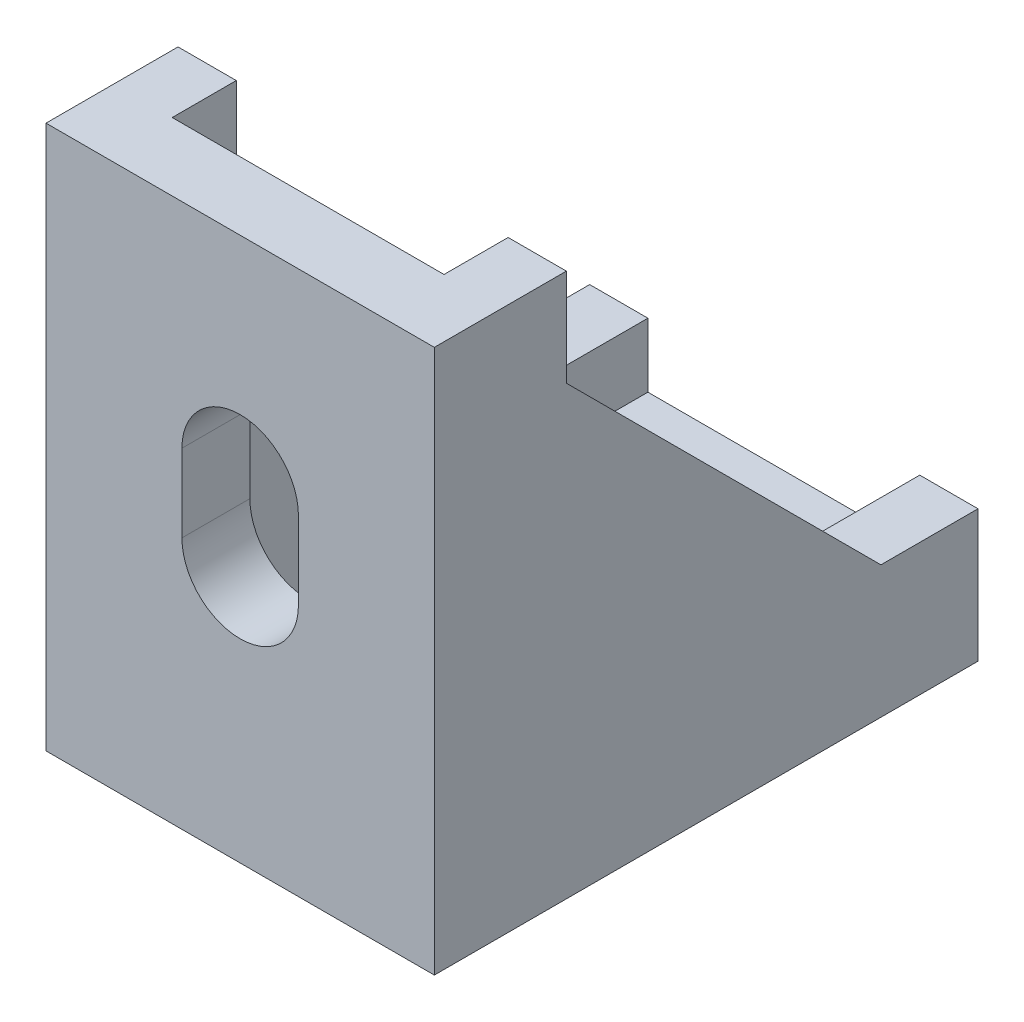
ISO-10303-21;
HEADER;
FILE_DESCRIPTION(('STEP AP214'),'2;1');
FILE_NAME('part.step','',(''),(''),'','','');
FILE_SCHEMA(('AUTOMOTIVE_DESIGN { 1 0 10303 214 1 1 1 1 }'));
ENDSEC;
DATA;
#1=APPLICATION_CONTEXT('core data for automotive mechanical design processes');
#2=APPLICATION_PROTOCOL_DEFINITION('international standard','automotive_design',2000,#1);
#3=PRODUCT_CONTEXT('',#1,'mechanical');
#4=PRODUCT('Part','Part','',(#3));
#5=PRODUCT_RELATED_PRODUCT_CATEGORY('part','',(#4));
#6=PRODUCT_DEFINITION_FORMATION('','',#4);
#7=PRODUCT_DEFINITION_CONTEXT('part definition',#1,'design');
#8=PRODUCT_DEFINITION('design','',#6,#7);
#9=PRODUCT_DEFINITION_SHAPE('','',#8);
#10=(LENGTH_UNIT() NAMED_UNIT(*) SI_UNIT(.MILLI.,.METRE.));
#11=(NAMED_UNIT(*) PLANE_ANGLE_UNIT() SI_UNIT($,.RADIAN.));
#12=(NAMED_UNIT(*) SI_UNIT($,.STERADIAN.) SOLID_ANGLE_UNIT());
#13=UNCERTAINTY_MEASURE_WITH_UNIT(LENGTH_MEASURE(1.E-05),#10,'distance_accuracy_value','');
#14=(GEOMETRIC_REPRESENTATION_CONTEXT(3) GLOBAL_UNCERTAINTY_ASSIGNED_CONTEXT((#13)) GLOBAL_UNIT_ASSIGNED_CONTEXT((#10,
#11,#12)) REPRESENTATION_CONTEXT('',''));
#15=CARTESIAN_POINT('',(0.,0.,0.));
#16=DIRECTION('',(0.,0.,1.));
#17=DIRECTION('',(1.,0.,0.));
#18=AXIS2_PLACEMENT_3D('',#15,#16,#17);
#19=CARTESIAN_POINT('',(0.,3.5,0.));
#20=DIRECTION('',(0.,-1.,0.));
#21=DIRECTION('',(0.,0.,-1.));
#22=AXIS2_PLACEMENT_3D('',#19,#20,#21);
#23=PLANE('',#22);
#24=DIRECTION('',(0.,0.,-1.));
#25=VECTOR('',#24,1.);
#26=CARTESIAN_POINT('',(3.,3.5,0.));
#27=LINE('',#26,#25);
#28=CARTESIAN_POINT('',(3.,3.5,0.999999999999999));
#29=VERTEX_POINT('',#28);
#30=CARTESIAN_POINT('',(3.,3.5,-3.));
#31=VERTEX_POINT('',#30);
#32=EDGE_CURVE('E391',#29,#31,#27,.T.);
#33=ORIENTED_EDGE('',*,*,#32,.F.);
#34=CARTESIAN_POINT('',(0.,3.5,0.999999999999999));
#35=DIRECTION('',(0.,1.,0.));
#36=DIRECTION('',(0.,0.,1.));
#37=AXIS2_PLACEMENT_3D('',#34,#35,#36);
#38=CIRCLE('',#37,3.);
#39=CARTESIAN_POINT('',(-3.,3.5,0.999999999999999));
#40=VERTEX_POINT('',#39);
#41=EDGE_CURVE('E400',#40,#29,#38,.T.);
#42=ORIENTED_EDGE('',*,*,#41,.F.);
#43=DIRECTION('',(0.,0.,-1.));
#44=VECTOR('',#43,1.);
#45=CARTESIAN_POINT('',(-3.,3.5,0.));
#46=LINE('',#45,#44);
#47=CARTESIAN_POINT('',(-3.,3.5,-3.));
#48=VERTEX_POINT('',#47);
#49=EDGE_CURVE('E78',#40,#48,#46,.T.);
#50=ORIENTED_EDGE('',*,*,#49,.T.);
#51=CARTESIAN_POINT('',(0.,3.5,-3.));
#52=DIRECTION('',(0.,1.,0.));
#53=DIRECTION('',(0.,0.,1.));
#54=AXIS2_PLACEMENT_3D('',#51,#52,#53);
#55=CIRCLE('',#54,3.);
#56=EDGE_CURVE('E394',#31,#48,#55,.T.);
#57=ORIENTED_EDGE('',*,*,#56,.F.);
#58=EDGE_LOOP('',(#33,#42,#50,#57));
#59=FACE_BOUND('',#58,.T.);
#60=DIRECTION('',(0.,0.,-1.));
#61=VECTOR('',#60,1.);
#62=CARTESIAN_POINT('',(-7.,3.5,0.));
#63=LINE('',#62,#61);
#64=CARTESIAN_POINT('',(-7.,3.5,10.5));
#65=VERTEX_POINT('',#64);
#66=CARTESIAN_POINT('',(-7.,3.5,-14.));
#67=VERTEX_POINT('',#66);
#68=EDGE_CURVE('E279',#65,#67,#63,.T.);
#69=ORIENTED_EDGE('',*,*,#68,.F.);
#70=DIRECTION('',(1.,0.,0.));
#71=VECTOR('',#70,1.);
#72=CARTESIAN_POINT('',(0.,3.5,10.5));
#73=LINE('',#72,#71);
#74=CARTESIAN_POINT('',(7.,3.5,10.5));
#75=VERTEX_POINT('',#74);
#76=EDGE_CURVE('E385',#65,#75,#73,.T.);
#77=ORIENTED_EDGE('',*,*,#76,.T.);
#78=DIRECTION('',(0.,0.,1.));
#79=VECTOR('',#78,1.);
#80=CARTESIAN_POINT('',(7.,3.5,0.));
#81=LINE('',#80,#79);
#82=CARTESIAN_POINT('',(7.,3.5,-14.));
#83=VERTEX_POINT('',#82);
#84=EDGE_CURVE('E330',#83,#75,#81,.T.);
#85=ORIENTED_EDGE('',*,*,#84,.F.);
#86=DIRECTION('',(-1.,0.,0.));
#87=VECTOR('',#86,1.);
#88=CARTESIAN_POINT('',(10.,3.5,-14.));
#89=LINE('',#88,#87);
#90=EDGE_CURVE('E429',#83,#67,#89,.T.);
#91=ORIENTED_EDGE('',*,*,#90,.T.);
#92=EDGE_LOOP('',(#69,#77,#85,#91));
#93=FACE_BOUND('',#92,.T.);
#94=ADVANCED_FACE('F60',(#59,#93),#23,.F.);
#95=CARTESIAN_POINT('',(0.,0.,10.5));
#96=DIRECTION('',(0.,0.,-1.));
#97=DIRECTION('',(-1.,0.,0.));
#98=AXIS2_PLACEMENT_3D('',#95,#96,#97);
#99=PLANE('',#98);
#100=CARTESIAN_POINT('',(0.,17.,10.5));
#101=DIRECTION('',(0.,0.,1.));
#102=DIRECTION('',(1.,0.,0.));
#103=AXIS2_PLACEMENT_3D('',#100,#101,#102);
#104=CIRCLE('',#103,3.);
#105=CARTESIAN_POINT('',(3.,17.,10.5));
#106=VERTEX_POINT('',#105);
#107=CARTESIAN_POINT('',(-3.,17.,10.5));
#108=VERTEX_POINT('',#107);
#109=EDGE_CURVE('E335',#106,#108,#104,.T.);
#110=ORIENTED_EDGE('',*,*,#109,.T.);
#111=DIRECTION('',(0.,-1.,0.));
#112=VECTOR('',#111,1.);
#113=CARTESIAN_POINT('',(-3.,17.,10.5));
#114=LINE('',#113,#112);
#115=CARTESIAN_POINT('',(-3.,13.,10.5));
#116=VERTEX_POINT('',#115);
#117=EDGE_CURVE('E339',#108,#116,#114,.T.);
#118=ORIENTED_EDGE('',*,*,#117,.T.);
#119=CARTESIAN_POINT('',(0.,13.,10.5));
#120=DIRECTION('',(0.,0.,1.));
#121=DIRECTION('',(1.,0.,0.));
#122=AXIS2_PLACEMENT_3D('',#119,#120,#121);
#123=CIRCLE('',#122,3.);
#124=CARTESIAN_POINT('',(3.,13.,10.5));
#125=VERTEX_POINT('',#124);
#126=EDGE_CURVE('E344',#116,#125,#123,.T.);
#127=ORIENTED_EDGE('',*,*,#126,.T.);
#128=DIRECTION('',(0.,1.,0.));
#129=VECTOR('',#128,1.);
#130=CARTESIAN_POINT('',(3.,17.,10.5));
#131=LINE('',#130,#129);
#132=EDGE_CURVE('E347',#125,#106,#131,.T.);
#133=ORIENTED_EDGE('',*,*,#132,.T.);
#134=EDGE_LOOP('',(#110,#118,#127,#133));
#135=FACE_BOUND('',#134,.T.);
#136=ORIENTED_EDGE('',*,*,#76,.F.);
#137=DIRECTION('',(0.,1.,0.));
#138=VECTOR('',#137,1.);
#139=CARTESIAN_POINT('',(-7.,0.,10.5));
#140=LINE('',#139,#138);
#141=CARTESIAN_POINT('',(-7.,28.,10.5));
#142=VERTEX_POINT('',#141);
#143=EDGE_CURVE('E271',#65,#142,#140,.T.);
#144=ORIENTED_EDGE('',*,*,#143,.T.);
#145=DIRECTION('',(-1.,0.,0.));
#146=VECTOR('',#145,1.);
#147=CARTESIAN_POINT('',(-10.,28.,10.5));
#148=LINE('',#147,#146);
#149=CARTESIAN_POINT('',(7.,28.,10.5));
#150=VERTEX_POINT('',#149);
#151=EDGE_CURVE('E222',#150,#142,#148,.T.);
#152=ORIENTED_EDGE('',*,*,#151,.F.);
#153=DIRECTION('',(0.,-1.,0.));
#154=VECTOR('',#153,1.);
#155=CARTESIAN_POINT('',(7.,0.,10.5));
#156=LINE('',#155,#154);
#157=EDGE_CURVE('E317',#150,#75,#156,.T.);
#158=ORIENTED_EDGE('',*,*,#157,.T.);
#159=EDGE_LOOP('',(#136,#144,#152,#158));
#160=FACE_BOUND('',#159,.T.);
#161=ADVANCED_FACE('F496',(#135,#160),#99,.T.);
#162=CARTESIAN_POINT('',(0.,0.,0.));
#163=DIRECTION('',(0.,-1.,0.));
#164=DIRECTION('',(0.,0.,-1.));
#165=AXIS2_PLACEMENT_3D('',#162,#163,#164);
#166=PLANE('',#165);
#167=DIRECTION('',(0.,0.,-1.));
#168=VECTOR('',#167,1.);
#169=CARTESIAN_POINT('',(-10.,0.,14.));
#170=LINE('',#169,#168);
#171=CARTESIAN_POINT('',(-10.,0.,14.));
#172=VERTEX_POINT('',#171);
#173=CARTESIAN_POINT('',(-10.,0.,-14.));
#174=VERTEX_POINT('',#173);
#175=EDGE_CURVE('E436',#172,#174,#170,.T.);
#176=ORIENTED_EDGE('',*,*,#175,.T.);
#177=DIRECTION('',(-1.,0.,0.));
#178=VECTOR('',#177,1.);
#179=CARTESIAN_POINT('',(10.,0.,-14.));
#180=LINE('',#179,#178);
#181=CARTESIAN_POINT('',(10.,0.,-14.));
#182=VERTEX_POINT('',#181);
#183=EDGE_CURVE('E440',#182,#174,#180,.T.);
#184=ORIENTED_EDGE('',*,*,#183,.F.);
#185=DIRECTION('',(0.,0.,-1.));
#186=VECTOR('',#185,1.);
#187=CARTESIAN_POINT('',(10.,0.,14.));
#188=LINE('',#187,#186);
#189=CARTESIAN_POINT('',(10.,0.,14.));
#190=VERTEX_POINT('',#189);
#191=EDGE_CURVE('E433',#190,#182,#188,.T.);
#192=ORIENTED_EDGE('',*,*,#191,.F.);
#193=DIRECTION('',(-1.,0.,0.));
#194=VECTOR('',#193,1.);
#195=CARTESIAN_POINT('',(10.,0.,14.));
#196=LINE('',#195,#194);
#197=EDGE_CURVE('E428',#190,#172,#196,.T.);
#198=ORIENTED_EDGE('',*,*,#197,.T.);
#199=EDGE_LOOP('',(#176,#184,#192,#198));
#200=FACE_BOUND('',#199,.T.);
#201=CARTESIAN_POINT('',(0.,0.,0.999999999999999));
#202=DIRECTION('',(0.,1.,0.));
#203=DIRECTION('',(0.,0.,1.));
#204=AXIS2_PLACEMENT_3D('',#201,#202,#203);
#205=CIRCLE('',#204,3.);
#206=CARTESIAN_POINT('',(-3.,0.,0.999999999999999));
#207=VERTEX_POINT('',#206);
#208=CARTESIAN_POINT('',(3.,0.,0.999999999999999));
#209=VERTEX_POINT('',#208);
#210=EDGE_CURVE('E395',#207,#209,#205,.T.);
#211=ORIENTED_EDGE('',*,*,#210,.T.);
#212=DIRECTION('',(0.,0.,-1.));
#213=VECTOR('',#212,1.);
#214=CARTESIAN_POINT('',(3.,0.,0.));
#215=LINE('',#214,#213);
#216=CARTESIAN_POINT('',(3.,0.,-3.));
#217=VERTEX_POINT('',#216);
#218=EDGE_CURVE('E86',#209,#217,#215,.T.);
#219=ORIENTED_EDGE('',*,*,#218,.T.);
#220=CARTESIAN_POINT('',(0.,0.,-3.));
#221=DIRECTION('',(0.,1.,0.));
#222=DIRECTION('',(0.,0.,1.));
#223=AXIS2_PLACEMENT_3D('',#220,#221,#222);
#224=CIRCLE('',#223,3.);
#225=CARTESIAN_POINT('',(-3.,0.,-3.));
#226=VERTEX_POINT('',#225);
#227=EDGE_CURVE('E406',#217,#226,#224,.T.);
#228=ORIENTED_EDGE('',*,*,#227,.T.);
#229=DIRECTION('',(0.,0.,-1.));
#230=VECTOR('',#229,1.);
#231=CARTESIAN_POINT('',(-3.,0.,0.));
#232=LINE('',#231,#230);
#233=EDGE_CURVE('E410',#207,#226,#232,.T.);
#234=ORIENTED_EDGE('',*,*,#233,.F.);
#235=EDGE_LOOP('',(#211,#219,#228,#234));
#236=FACE_BOUND('',#235,.T.);
#237=ADVANCED_FACE('F462',(#200,#236),#166,.T.);
#238=CARTESIAN_POINT('',(10.,3.5,14.));
#239=DIRECTION('',(0.,0.,1.));
#240=DIRECTION('',(1.,0.,0.));
#241=AXIS2_PLACEMENT_3D('',#238,#239,#240);
#242=PLANE('',#241);
#243=DIRECTION('',(0.,-1.,0.));
#244=VECTOR('',#243,1.);
#245=CARTESIAN_POINT('',(-10.,3.5,14.));
#246=LINE('',#245,#244);
#247=CARTESIAN_POINT('',(-10.,28.,14.));
#248=VERTEX_POINT('',#247);
#249=EDGE_CURVE('E64',#248,#172,#246,.T.);
#250=ORIENTED_EDGE('',*,*,#249,.T.);
#251=ORIENTED_EDGE('',*,*,#197,.F.);
#252=DIRECTION('',(0.,-1.,0.));
#253=VECTOR('',#252,1.);
#254=CARTESIAN_POINT('',(10.,3.5,14.));
#255=LINE('',#254,#253);
#256=CARTESIAN_POINT('',(10.,28.,14.));
#257=VERTEX_POINT('',#256);
#258=EDGE_CURVE('E12',#257,#190,#255,.T.);
#259=ORIENTED_EDGE('',*,*,#258,.F.);
#260=DIRECTION('',(-1.,0.,0.));
#261=VECTOR('',#260,1.);
#262=CARTESIAN_POINT('',(-10.,28.,14.));
#263=LINE('',#262,#261);
#264=EDGE_CURVE('E367',#257,#248,#263,.T.);
#265=ORIENTED_EDGE('',*,*,#264,.T.);
#266=EDGE_LOOP('',(#250,#251,#259,#265));
#267=FACE_BOUND('',#266,.T.);
#268=DIRECTION('',(0.,-1.,0.));
#269=VECTOR('',#268,1.);
#270=CARTESIAN_POINT('',(-3.,17.,14.));
#271=LINE('',#270,#269);
#272=CARTESIAN_POINT('',(-3.,17.,14.));
#273=VERTEX_POINT('',#272);
#274=CARTESIAN_POINT('',(-3.,13.,14.));
#275=VERTEX_POINT('',#274);
#276=EDGE_CURVE('E354',#273,#275,#271,.T.);
#277=ORIENTED_EDGE('',*,*,#276,.F.);
#278=CARTESIAN_POINT('',(0.,17.,14.));
#279=DIRECTION('',(0.,0.,1.));
#280=DIRECTION('',(1.,0.,0.));
#281=AXIS2_PLACEMENT_3D('',#278,#279,#280);
#282=CIRCLE('',#281,3.);
#283=CARTESIAN_POINT('',(3.,17.,14.));
#284=VERTEX_POINT('',#283);
#285=EDGE_CURVE('E334',#284,#273,#282,.T.);
#286=ORIENTED_EDGE('',*,*,#285,.F.);
#287=DIRECTION('',(0.,1.,0.));
#288=VECTOR('',#287,1.);
#289=CARTESIAN_POINT('',(3.,17.,14.));
#290=LINE('',#289,#288);
#291=CARTESIAN_POINT('',(3.,13.,14.));
#292=VERTEX_POINT('',#291);
#293=EDGE_CURVE('E340',#292,#284,#290,.T.);
#294=ORIENTED_EDGE('',*,*,#293,.F.);
#295=CARTESIAN_POINT('',(0.,13.,14.));
#296=DIRECTION('',(0.,0.,1.));
#297=DIRECTION('',(1.,0.,0.));
#298=AXIS2_PLACEMENT_3D('',#295,#296,#297);
#299=CIRCLE('',#298,3.);
#300=EDGE_CURVE('E358',#275,#292,#299,.T.);
#301=ORIENTED_EDGE('',*,*,#300,.F.);
#302=EDGE_LOOP('',(#277,#286,#294,#301));
#303=FACE_BOUND('',#302,.T.);
#304=ADVANCED_FACE('F62',(#267,#303),#242,.T.);
#305=CARTESIAN_POINT('',(10.,3.5,14.));
#306=DIRECTION('',(-1.,0.,0.));
#307=DIRECTION('',(0.,0.,1.));
#308=AXIS2_PLACEMENT_3D('',#305,#306,#307);
#309=PLANE('',#308);
#310=DIRECTION('',(0.,-1.,0.));
#311=VECTOR('',#310,1.);
#312=CARTESIAN_POINT('',(10.,3.5,-14.));
#313=LINE('',#312,#311);
#314=CARTESIAN_POINT('',(10.,6.8,-14.));
#315=VERTEX_POINT('',#314);
#316=EDGE_CURVE('E70',#315,#182,#313,.T.);
#317=ORIENTED_EDGE('',*,*,#316,.F.);
#318=DIRECTION('',(0.,0.,1.));
#319=VECTOR('',#318,1.);
#320=CARTESIAN_POINT('',(10.,6.8,-14.));
#321=LINE('',#320,#319);
#322=CARTESIAN_POINT('',(10.,6.8,-9.));
#323=VERTEX_POINT('',#322);
#324=EDGE_CURVE('E282',#315,#323,#321,.T.);
#325=ORIENTED_EDGE('',*,*,#324,.T.);
#326=DIRECTION('',(0.,0.707106781186548,0.707106781186548));
#327=VECTOR('',#326,1.);
#328=CARTESIAN_POINT('',(10.,6.8,-9.));
#329=LINE('',#328,#327);
#330=CARTESIAN_POINT('',(10.,23.,7.2));
#331=VERTEX_POINT('',#330);
#332=EDGE_CURVE('E306',#323,#331,#329,.T.);
#333=ORIENTED_EDGE('',*,*,#332,.T.);
#334=DIRECTION('',(0.,1.,0.));
#335=VECTOR('',#334,1.);
#336=CARTESIAN_POINT('',(10.,28.,7.2));
#337=LINE('',#336,#335);
#338=CARTESIAN_POINT('',(10.,28.,7.2));
#339=VERTEX_POINT('',#338);
#340=EDGE_CURVE('E287',#331,#339,#337,.T.);
#341=ORIENTED_EDGE('',*,*,#340,.T.);
#342=DIRECTION('',(0.,0.,1.));
#343=VECTOR('',#342,1.);
#344=CARTESIAN_POINT('',(10.,28.,10.5));
#345=LINE('',#344,#343);
#346=EDGE_CURVE('E379',#339,#257,#345,.T.);
#347=ORIENTED_EDGE('',*,*,#346,.T.);
#348=ORIENTED_EDGE('',*,*,#258,.T.);
#349=ORIENTED_EDGE('',*,*,#191,.T.);
#350=EDGE_LOOP('',(#317,#325,#333,#341,#347,#348,#349));
#351=FACE_BOUND('',#350,.T.);
#352=ADVANCED_FACE('F466',(#351),#309,.F.);
#353=CARTESIAN_POINT('',(10.,3.5,-14.));
#354=DIRECTION('',(0.,0.,1.));
#355=DIRECTION('',(1.,0.,0.));
#356=AXIS2_PLACEMENT_3D('',#353,#354,#355);
#357=PLANE('',#356);
#358=DIRECTION('',(0.,-1.,0.));
#359=VECTOR('',#358,1.);
#360=CARTESIAN_POINT('',(-10.,3.5,-14.));
#361=LINE('',#360,#359);
#362=CARTESIAN_POINT('',(-10.,6.8,-14.));
#363=VERTEX_POINT('',#362);
#364=EDGE_CURVE('E447',#363,#174,#361,.T.);
#365=ORIENTED_EDGE('',*,*,#364,.F.);
#366=DIRECTION('',(-1.,0.,0.));
#367=VECTOR('',#366,1.);
#368=CARTESIAN_POINT('',(-7.,6.8,-14.));
#369=LINE('',#368,#367);
#370=CARTESIAN_POINT('',(-7.,6.8,-14.));
#371=VERTEX_POINT('',#370);
#372=EDGE_CURVE('E267',#371,#363,#369,.T.);
#373=ORIENTED_EDGE('',*,*,#372,.F.);
#374=DIRECTION('',(0.,-1.,0.));
#375=VECTOR('',#374,1.);
#376=CARTESIAN_POINT('',(-7.,6.8,-14.));
#377=LINE('',#376,#375);
#378=EDGE_CURVE('E237',#371,#67,#377,.T.);
#379=ORIENTED_EDGE('',*,*,#378,.T.);
#380=ORIENTED_EDGE('',*,*,#90,.F.);
#381=DIRECTION('',(0.,1.,0.));
#382=VECTOR('',#381,1.);
#383=CARTESIAN_POINT('',(7.,0.,-14.));
#384=LINE('',#383,#382);
#385=CARTESIAN_POINT('',(7.,6.8,-14.));
#386=VERTEX_POINT('',#385);
#387=EDGE_CURVE('E283',#83,#386,#384,.T.);
#388=ORIENTED_EDGE('',*,*,#387,.T.);
#389=DIRECTION('',(1.,0.,0.));
#390=VECTOR('',#389,1.);
#391=CARTESIAN_POINT('',(7.,6.8,-14.));
#392=LINE('',#391,#390);
#393=EDGE_CURVE('E302',#386,#315,#392,.T.);
#394=ORIENTED_EDGE('',*,*,#393,.T.);
#395=ORIENTED_EDGE('',*,*,#316,.T.);
#396=ORIENTED_EDGE('',*,*,#183,.T.);
#397=EDGE_LOOP('',(#365,#373,#379,#380,#388,#394,#395,#396));
#398=FACE_BOUND('',#397,.T.);
#399=ADVANCED_FACE('F468',(#398),#357,.F.);
#400=CARTESIAN_POINT('',(-10.,3.5,14.));
#401=DIRECTION('',(-1.,0.,0.));
#402=DIRECTION('',(0.,0.,1.));
#403=AXIS2_PLACEMENT_3D('',#400,#401,#402);
#404=PLANE('',#403);
#405=DIRECTION('',(0.,0.,-1.));
#406=VECTOR('',#405,1.);
#407=CARTESIAN_POINT('',(-10.,6.8,-9.));
#408=LINE('',#407,#406);
#409=CARTESIAN_POINT('',(-10.,6.8,-9.));
#410=VERTEX_POINT('',#409);
#411=EDGE_CURVE('E228',#410,#363,#408,.T.);
#412=ORIENTED_EDGE('',*,*,#411,.T.);
#413=ORIENTED_EDGE('',*,*,#364,.T.);
#414=ORIENTED_EDGE('',*,*,#175,.F.);
#415=ORIENTED_EDGE('',*,*,#249,.F.);
#416=DIRECTION('',(0.,0.,1.));
#417=VECTOR('',#416,1.);
#418=CARTESIAN_POINT('',(-10.,28.,10.5));
#419=LINE('',#418,#417);
#420=CARTESIAN_POINT('',(-10.,28.,7.2));
#421=VERTEX_POINT('',#420);
#422=EDGE_CURVE('E382',#421,#248,#419,.T.);
#423=ORIENTED_EDGE('',*,*,#422,.F.);
#424=DIRECTION('',(0.,-1.,0.));
#425=VECTOR('',#424,1.);
#426=CARTESIAN_POINT('',(-10.,28.,7.2));
#427=LINE('',#426,#425);
#428=CARTESIAN_POINT('',(-10.,23.,7.2));
#429=VERTEX_POINT('',#428);
#430=EDGE_CURVE('E234',#421,#429,#427,.T.);
#431=ORIENTED_EDGE('',*,*,#430,.T.);
#432=DIRECTION('',(0.,-0.707106781186548,-0.707106781186548));
#433=VECTOR('',#432,1.);
#434=CARTESIAN_POINT('',(-10.,23.,7.2));
#435=LINE('',#434,#433);
#436=EDGE_CURVE('E260',#429,#410,#435,.T.);
#437=ORIENTED_EDGE('',*,*,#436,.T.);
#438=EDGE_LOOP('',(#412,#413,#414,#415,#423,#431,#437));
#439=FACE_BOUND('',#438,.T.);
#440=ADVANCED_FACE('F459',(#439),#404,.T.);
#441=CARTESIAN_POINT('',(3.,3.5,0.));
#442=DIRECTION('',(-1.,0.,0.));
#443=DIRECTION('',(0.,0.,1.));
#444=AXIS2_PLACEMENT_3D('',#441,#442,#443);
#445=PLANE('',#444);
#446=ORIENTED_EDGE('',*,*,#218,.F.);
#447=DIRECTION('',(0.,-1.,0.));
#448=VECTOR('',#447,1.);
#449=CARTESIAN_POINT('',(3.,3.5,0.999999999999999));
#450=LINE('',#449,#448);
#451=EDGE_CURVE('E403',#29,#209,#450,.T.);
#452=ORIENTED_EDGE('',*,*,#451,.F.);
#453=ORIENTED_EDGE('',*,*,#32,.T.);
#454=DIRECTION('',(0.,-1.,0.));
#455=VECTOR('',#454,1.);
#456=CARTESIAN_POINT('',(3.,3.5,-3.));
#457=LINE('',#456,#455);
#458=EDGE_CURVE('E425',#31,#217,#457,.T.);
#459=ORIENTED_EDGE('',*,*,#458,.T.);
#460=EDGE_LOOP('',(#446,#452,#453,#459));
#461=FACE_BOUND('',#460,.T.);
#462=ADVANCED_FACE('F522',(#461),#445,.T.);
#463=CARTESIAN_POINT('',(0.,3.5,-3.));
#464=DIRECTION('',(0.,-1.,0.));
#465=DIRECTION('',(0.,0.,-1.));
#466=AXIS2_PLACEMENT_3D('',#463,#464,#465);
#467=CYLINDRICAL_SURFACE('',#466,3.);
#468=ORIENTED_EDGE('',*,*,#227,.F.);
#469=ORIENTED_EDGE('',*,*,#458,.F.);
#470=ORIENTED_EDGE('',*,*,#56,.T.);
#471=DIRECTION('',(0.,-1.,0.));
#472=VECTOR('',#471,1.);
#473=CARTESIAN_POINT('',(-3.,3.5,-3.));
#474=LINE('',#473,#472);
#475=EDGE_CURVE('E422',#48,#226,#474,.T.);
#476=ORIENTED_EDGE('',*,*,#475,.T.);
#477=EDGE_LOOP('',(#468,#469,#470,#476));
#478=FACE_BOUND('',#477,.T.);
#479=ADVANCED_FACE('F533',(#478),#467,.F.);
#480=CARTESIAN_POINT('',(-3.,3.5,0.));
#481=DIRECTION('',(-1.,0.,0.));
#482=DIRECTION('',(0.,0.,1.));
#483=AXIS2_PLACEMENT_3D('',#480,#481,#482);
#484=PLANE('',#483);
#485=ORIENTED_EDGE('',*,*,#233,.T.);
#486=ORIENTED_EDGE('',*,*,#475,.F.);
#487=ORIENTED_EDGE('',*,*,#49,.F.);
#488=DIRECTION('',(0.,-1.,0.));
#489=VECTOR('',#488,1.);
#490=CARTESIAN_POINT('',(-3.,3.5,0.999999999999999));
#491=LINE('',#490,#489);
#492=EDGE_CURVE('E419',#40,#207,#491,.T.);
#493=ORIENTED_EDGE('',*,*,#492,.T.);
#494=EDGE_LOOP('',(#485,#486,#487,#493));
#495=FACE_BOUND('',#494,.T.);
#496=ADVANCED_FACE('F537',(#495),#484,.F.);
#497=CARTESIAN_POINT('',(0.,3.5,0.999999999999999));
#498=DIRECTION('',(0.,-1.,0.));
#499=DIRECTION('',(0.,0.,-1.));
#500=AXIS2_PLACEMENT_3D('',#497,#498,#499);
#501=CYLINDRICAL_SURFACE('',#500,3.);
#502=ORIENTED_EDGE('',*,*,#210,.F.);
#503=ORIENTED_EDGE('',*,*,#492,.F.);
#504=ORIENTED_EDGE('',*,*,#41,.T.);
#505=ORIENTED_EDGE('',*,*,#451,.T.);
#506=EDGE_LOOP('',(#502,#503,#504,#505));
#507=FACE_BOUND('',#506,.T.);
#508=ADVANCED_FACE('F542',(#507),#501,.F.);
#509=CARTESIAN_POINT('',(-10.,28.,10.5));
#510=DIRECTION('',(0.,1.,0.));
#511=DIRECTION('',(0.,0.,1.));
#512=AXIS2_PLACEMENT_3D('',#509,#510,#511);
#513=PLANE('',#512);
#514=ORIENTED_EDGE('',*,*,#422,.T.);
#515=ORIENTED_EDGE('',*,*,#264,.F.);
#516=ORIENTED_EDGE('',*,*,#346,.F.);
#517=DIRECTION('',(1.,0.,0.));
#518=VECTOR('',#517,1.);
#519=CARTESIAN_POINT('',(7.,28.,7.2));
#520=LINE('',#519,#518);
#521=CARTESIAN_POINT('',(7.,28.,7.2));
#522=VERTEX_POINT('',#521);
#523=EDGE_CURVE('E313',#522,#339,#520,.T.);
#524=ORIENTED_EDGE('',*,*,#523,.F.);
#525=DIRECTION('',(0.,0.,1.));
#526=VECTOR('',#525,1.);
#527=CARTESIAN_POINT('',(7.,28.,14.));
#528=LINE('',#527,#526);
#529=EDGE_CURVE('E299',#522,#150,#528,.T.);
#530=ORIENTED_EDGE('',*,*,#529,.T.);
#531=ORIENTED_EDGE('',*,*,#151,.T.);
#532=DIRECTION('',(0.,0.,-1.));
#533=VECTOR('',#532,1.);
#534=CARTESIAN_POINT('',(-7.,28.,14.));
#535=LINE('',#534,#533);
#536=CARTESIAN_POINT('',(-7.,28.,7.2));
#537=VERTEX_POINT('',#536);
#538=EDGE_CURVE('E214',#142,#537,#535,.T.);
#539=ORIENTED_EDGE('',*,*,#538,.T.);
#540=DIRECTION('',(-1.,0.,0.));
#541=VECTOR('',#540,1.);
#542=CARTESIAN_POINT('',(-7.,28.,7.2));
#543=LINE('',#542,#541);
#544=EDGE_CURVE('E218',#537,#421,#543,.T.);
#545=ORIENTED_EDGE('',*,*,#544,.T.);
#546=EDGE_LOOP('',(#514,#515,#516,#524,#530,#531,#539,#545));
#547=FACE_BOUND('',#546,.T.);
#548=ADVANCED_FACE('F217',(#547),#513,.T.);
#549=CARTESIAN_POINT('',(0.,17.,10.5));
#550=DIRECTION('',(0.,0.,1.));
#551=DIRECTION('',(1.,0.,0.));
#552=AXIS2_PLACEMENT_3D('',#549,#550,#551);
#553=CYLINDRICAL_SURFACE('',#552,3.);
#554=ORIENTED_EDGE('',*,*,#285,.T.);
#555=DIRECTION('',(0.,0.,1.));
#556=VECTOR('',#555,1.);
#557=CARTESIAN_POINT('',(-3.,17.,10.5));
#558=LINE('',#557,#556);
#559=EDGE_CURVE('E351',#108,#273,#558,.T.);
#560=ORIENTED_EDGE('',*,*,#559,.F.);
#561=ORIENTED_EDGE('',*,*,#109,.F.);
#562=DIRECTION('',(0.,0.,1.));
#563=VECTOR('',#562,1.);
#564=CARTESIAN_POINT('',(3.,17.,10.5));
#565=LINE('',#564,#563);
#566=EDGE_CURVE('E365',#106,#284,#565,.T.);
#567=ORIENTED_EDGE('',*,*,#566,.T.);
#568=EDGE_LOOP('',(#554,#560,#561,#567));
#569=FACE_BOUND('',#568,.T.);
#570=ADVANCED_FACE('F549',(#569),#553,.F.);
#571=CARTESIAN_POINT('',(3.,17.,10.5));
#572=DIRECTION('',(1.,0.,0.));
#573=DIRECTION('',(0.,0.,-1.));
#574=AXIS2_PLACEMENT_3D('',#571,#572,#573);
#575=PLANE('',#574);
#576=ORIENTED_EDGE('',*,*,#293,.T.);
#577=ORIENTED_EDGE('',*,*,#566,.F.);
#578=ORIENTED_EDGE('',*,*,#132,.F.);
#579=DIRECTION('',(0.,0.,1.));
#580=VECTOR('',#579,1.);
#581=CARTESIAN_POINT('',(3.,13.,10.5));
#582=LINE('',#581,#580);
#583=EDGE_CURVE('E368',#125,#292,#582,.T.);
#584=ORIENTED_EDGE('',*,*,#583,.T.);
#585=EDGE_LOOP('',(#576,#577,#578,#584));
#586=FACE_BOUND('',#585,.T.);
#587=ADVANCED_FACE('F552',(#586),#575,.F.);
#588=CARTESIAN_POINT('',(0.,13.,10.5));
#589=DIRECTION('',(0.,0.,1.));
#590=DIRECTION('',(1.,0.,0.));
#591=AXIS2_PLACEMENT_3D('',#588,#589,#590);
#592=CYLINDRICAL_SURFACE('',#591,3.);
#593=ORIENTED_EDGE('',*,*,#300,.T.);
#594=ORIENTED_EDGE('',*,*,#583,.F.);
#595=ORIENTED_EDGE('',*,*,#126,.F.);
#596=DIRECTION('',(0.,0.,1.));
#597=VECTOR('',#596,1.);
#598=CARTESIAN_POINT('',(-3.,13.,10.5));
#599=LINE('',#598,#597);
#600=EDGE_CURVE('E371',#116,#275,#599,.T.);
#601=ORIENTED_EDGE('',*,*,#600,.T.);
#602=EDGE_LOOP('',(#593,#594,#595,#601));
#603=FACE_BOUND('',#602,.T.);
#604=ADVANCED_FACE('F507',(#603),#592,.F.);
#605=CARTESIAN_POINT('',(-3.,17.,10.5));
#606=DIRECTION('',(-1.,0.,0.));
#607=DIRECTION('',(0.,-1.,0.));
#608=AXIS2_PLACEMENT_3D('',#605,#606,#607);
#609=PLANE('',#608);
#610=ORIENTED_EDGE('',*,*,#276,.T.);
#611=ORIENTED_EDGE('',*,*,#600,.F.);
#612=ORIENTED_EDGE('',*,*,#117,.F.);
#613=ORIENTED_EDGE('',*,*,#559,.T.);
#614=EDGE_LOOP('',(#610,#611,#612,#613));
#615=FACE_BOUND('',#614,.T.);
#616=ADVANCED_FACE('F500',(#615),#609,.F.);
#617=CARTESIAN_POINT('',(7.,0.,0.));
#618=DIRECTION('',(1.,0.,0.));
#619=DIRECTION('',(0.,0.,-1.));
#620=AXIS2_PLACEMENT_3D('',#617,#618,#619);
#621=PLANE('',#620);
#622=ORIENTED_EDGE('',*,*,#387,.F.);
#623=ORIENTED_EDGE('',*,*,#84,.T.);
#624=ORIENTED_EDGE('',*,*,#157,.F.);
#625=ORIENTED_EDGE('',*,*,#529,.F.);
#626=DIRECTION('',(0.,1.,0.));
#627=VECTOR('',#626,1.);
#628=CARTESIAN_POINT('',(7.,28.,7.2));
#629=LINE('',#628,#627);
#630=CARTESIAN_POINT('',(7.,23.,7.2));
#631=VERTEX_POINT('',#630);
#632=EDGE_CURVE('E295',#631,#522,#629,.T.);
#633=ORIENTED_EDGE('',*,*,#632,.F.);
#634=DIRECTION('',(0.,0.707106781186548,0.707106781186548));
#635=VECTOR('',#634,1.);
#636=CARTESIAN_POINT('',(7.,6.8,-9.));
#637=LINE('',#636,#635);
#638=CARTESIAN_POINT('',(7.,6.8,-9.));
#639=VERTEX_POINT('',#638);
#640=EDGE_CURVE('E291',#639,#631,#637,.T.);
#641=ORIENTED_EDGE('',*,*,#640,.F.);
#642=DIRECTION('',(0.,0.,1.));
#643=VECTOR('',#642,1.);
#644=CARTESIAN_POINT('',(7.,6.8,-14.));
#645=LINE('',#644,#643);
#646=EDGE_CURVE('E286',#386,#639,#645,.T.);
#647=ORIENTED_EDGE('',*,*,#646,.F.);
#648=EDGE_LOOP('',(#622,#623,#624,#625,#633,#641,#647));
#649=FACE_BOUND('',#648,.T.);
#650=ADVANCED_FACE('F498',(#649),#621,.F.);
#651=CARTESIAN_POINT('',(7.,28.,7.2));
#652=DIRECTION('',(0.,0.,-1.));
#653=DIRECTION('',(0.,1.,0.));
#654=AXIS2_PLACEMENT_3D('',#651,#652,#653);
#655=PLANE('',#654);
#656=ORIENTED_EDGE('',*,*,#340,.F.);
#657=DIRECTION('',(1.,0.,0.));
#658=VECTOR('',#657,1.);
#659=CARTESIAN_POINT('',(7.,23.,7.2));
#660=LINE('',#659,#658);
#661=EDGE_CURVE('E318',#631,#331,#660,.T.);
#662=ORIENTED_EDGE('',*,*,#661,.F.);
#663=ORIENTED_EDGE('',*,*,#632,.T.);
#664=ORIENTED_EDGE('',*,*,#523,.T.);
#665=EDGE_LOOP('',(#656,#662,#663,#664));
#666=FACE_BOUND('',#665,.T.);
#667=ADVANCED_FACE('F482',(#666),#655,.T.);
#668=CARTESIAN_POINT('',(7.,6.8,-9.));
#669=DIRECTION('',(0.,0.707106781186548,-0.707106781186547));
#670=DIRECTION('',(0.,0.707106781186547,0.707106781186548));
#671=AXIS2_PLACEMENT_3D('',#668,#669,#670);
#672=PLANE('',#671);
#673=ORIENTED_EDGE('',*,*,#332,.F.);
#674=DIRECTION('',(1.,0.,0.));
#675=VECTOR('',#674,1.);
#676=CARTESIAN_POINT('',(7.,6.8,-9.));
#677=LINE('',#676,#675);
#678=EDGE_CURVE('E321',#639,#323,#677,.T.);
#679=ORIENTED_EDGE('',*,*,#678,.F.);
#680=ORIENTED_EDGE('',*,*,#640,.T.);
#681=ORIENTED_EDGE('',*,*,#661,.T.);
#682=EDGE_LOOP('',(#673,#679,#680,#681));
#683=FACE_BOUND('',#682,.T.);
#684=ADVANCED_FACE('F478',(#683),#672,.T.);
#685=CARTESIAN_POINT('',(7.,6.8,-14.));
#686=DIRECTION('',(0.,1.,0.));
#687=DIRECTION('',(0.,0.,1.));
#688=AXIS2_PLACEMENT_3D('',#685,#686,#687);
#689=PLANE('',#688);
#690=ORIENTED_EDGE('',*,*,#324,.F.);
#691=ORIENTED_EDGE('',*,*,#393,.F.);
#692=ORIENTED_EDGE('',*,*,#646,.T.);
#693=ORIENTED_EDGE('',*,*,#678,.T.);
#694=EDGE_LOOP('',(#690,#691,#692,#693));
#695=FACE_BOUND('',#694,.T.);
#696=ADVANCED_FACE('F474',(#695),#689,.T.);
#697=CARTESIAN_POINT('',(-7.,0.,0.));
#698=DIRECTION('',(-1.,0.,0.));
#699=DIRECTION('',(0.,0.,1.));
#700=AXIS2_PLACEMENT_3D('',#697,#698,#699);
#701=PLANE('',#700);
#702=ORIENTED_EDGE('',*,*,#143,.F.);
#703=ORIENTED_EDGE('',*,*,#68,.T.);
#704=ORIENTED_EDGE('',*,*,#378,.F.);
#705=DIRECTION('',(0.,0.,-1.));
#706=VECTOR('',#705,1.);
#707=CARTESIAN_POINT('',(-7.,6.8,-9.));
#708=LINE('',#707,#706);
#709=CARTESIAN_POINT('',(-7.,6.8,-9.));
#710=VERTEX_POINT('',#709);
#711=EDGE_CURVE('E249',#710,#371,#708,.T.);
#712=ORIENTED_EDGE('',*,*,#711,.F.);
#713=DIRECTION('',(0.,-0.707106781186548,-0.707106781186548));
#714=VECTOR('',#713,1.);
#715=CARTESIAN_POINT('',(-7.,23.,7.2));
#716=LINE('',#715,#714);
#717=CARTESIAN_POINT('',(-7.,23.,7.2));
#718=VERTEX_POINT('',#717);
#719=EDGE_CURVE('E243',#718,#710,#716,.T.);
#720=ORIENTED_EDGE('',*,*,#719,.F.);
#721=DIRECTION('',(0.,-1.,0.));
#722=VECTOR('',#721,1.);
#723=CARTESIAN_POINT('',(-7.,28.,7.2));
#724=LINE('',#723,#722);
#725=EDGE_CURVE('E227',#537,#718,#724,.T.);
#726=ORIENTED_EDGE('',*,*,#725,.F.);
#727=ORIENTED_EDGE('',*,*,#538,.F.);
#728=EDGE_LOOP('',(#702,#703,#704,#712,#720,#726,#727));
#729=FACE_BOUND('',#728,.T.);
#730=ADVANCED_FACE('F240',(#729),#701,.F.);
#731=CARTESIAN_POINT('',(-7.,6.8,-9.));
#732=DIRECTION('',(0.,1.,0.));
#733=DIRECTION('',(0.,0.,1.));
#734=AXIS2_PLACEMENT_3D('',#731,#732,#733);
#735=PLANE('',#734);
#736=ORIENTED_EDGE('',*,*,#411,.F.);
#737=DIRECTION('',(-1.,0.,0.));
#738=VECTOR('',#737,1.);
#739=CARTESIAN_POINT('',(-7.,6.8,-9.));
#740=LINE('',#739,#738);
#741=EDGE_CURVE('E272',#710,#410,#740,.T.);
#742=ORIENTED_EDGE('',*,*,#741,.F.);
#743=ORIENTED_EDGE('',*,*,#711,.T.);
#744=ORIENTED_EDGE('',*,*,#372,.T.);
#745=EDGE_LOOP('',(#736,#742,#743,#744));
#746=FACE_BOUND('',#745,.T.);
#747=ADVANCED_FACE('F489',(#746),#735,.T.);
#748=CARTESIAN_POINT('',(-7.,23.,7.2));
#749=DIRECTION('',(0.,0.707106781186548,-0.707106781186547));
#750=DIRECTION('',(0.,0.707106781186547,0.707106781186548));
#751=AXIS2_PLACEMENT_3D('',#748,#749,#750);
#752=PLANE('',#751);
#753=ORIENTED_EDGE('',*,*,#436,.F.);
#754=DIRECTION('',(-1.,0.,0.));
#755=VECTOR('',#754,1.);
#756=CARTESIAN_POINT('',(-7.,23.,7.2));
#757=LINE('',#756,#755);
#758=EDGE_CURVE('E236',#718,#429,#757,.T.);
#759=ORIENTED_EDGE('',*,*,#758,.F.);
#760=ORIENTED_EDGE('',*,*,#719,.T.);
#761=ORIENTED_EDGE('',*,*,#741,.T.);
#762=EDGE_LOOP('',(#753,#759,#760,#761));
#763=FACE_BOUND('',#762,.T.);
#764=ADVANCED_FACE('F487',(#763),#752,.T.);
#765=CARTESIAN_POINT('',(-7.,28.,7.2));
#766=DIRECTION('',(0.,0.,-1.));
#767=DIRECTION('',(0.,1.,0.));
#768=AXIS2_PLACEMENT_3D('',#765,#766,#767);
#769=PLANE('',#768);
#770=ORIENTED_EDGE('',*,*,#430,.F.);
#771=ORIENTED_EDGE('',*,*,#544,.F.);
#772=ORIENTED_EDGE('',*,*,#725,.T.);
#773=ORIENTED_EDGE('',*,*,#758,.T.);
#774=EDGE_LOOP('',(#770,#771,#772,#773));
#775=FACE_BOUND('',#774,.T.);
#776=ADVANCED_FACE('F232',(#775),#769,.T.);
#777=CLOSED_SHELL('',(#94,#161,#237,#304,#352,#399,#440,#462,#479,#496,#508,#548,#570,#587,#604,
#616,#650,#667,#684,#696,#730,#747,#764,#776));
#778=MANIFOLD_SOLID_BREP('B2',#777);
#779=ADVANCED_BREP_SHAPE_REPRESENTATION('',(#18,#778),#14);
#780=SHAPE_DEFINITION_REPRESENTATION(#9,#779);
ENDSEC;
END-ISO-10303-21;
